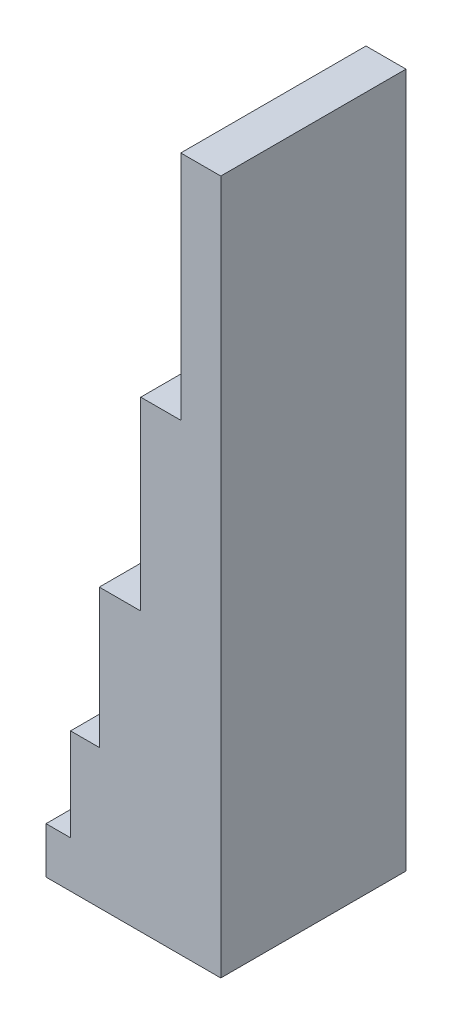
ISO-10303-21;
HEADER;
FILE_DESCRIPTION(('STEP AP214'),'2;1');
FILE_NAME('part.step','',(''),(''),'','','');
FILE_SCHEMA(('AUTOMOTIVE_DESIGN { 1 0 10303 214 1 1 1 1 }'));
ENDSEC;
DATA;
#1=APPLICATION_CONTEXT('core data for automotive mechanical design processes');
#2=APPLICATION_PROTOCOL_DEFINITION('international standard','automotive_design',2000,#1);
#3=PRODUCT_CONTEXT('',#1,'mechanical');
#4=PRODUCT('Part','Part','',(#3));
#5=PRODUCT_RELATED_PRODUCT_CATEGORY('part','',(#4));
#6=PRODUCT_DEFINITION_FORMATION('','',#4);
#7=PRODUCT_DEFINITION_CONTEXT('part definition',#1,'design');
#8=PRODUCT_DEFINITION('design','',#6,#7);
#9=PRODUCT_DEFINITION_SHAPE('','',#8);
#10=(LENGTH_UNIT() NAMED_UNIT(*) SI_UNIT(.MILLI.,.METRE.));
#11=(NAMED_UNIT(*) PLANE_ANGLE_UNIT() SI_UNIT($,.RADIAN.));
#12=(NAMED_UNIT(*) SI_UNIT($,.STERADIAN.) SOLID_ANGLE_UNIT());
#13=UNCERTAINTY_MEASURE_WITH_UNIT(LENGTH_MEASURE(1.E-05),#10,'distance_accuracy_value','');
#14=(GEOMETRIC_REPRESENTATION_CONTEXT(3) GLOBAL_UNCERTAINTY_ASSIGNED_CONTEXT((#13)) GLOBAL_UNIT_ASSIGNED_CONTEXT((#10,
#11,#12)) REPRESENTATION_CONTEXT('',''));
#15=CARTESIAN_POINT('',(0.,0.,0.));
#16=DIRECTION('',(0.,0.,1.));
#17=DIRECTION('',(1.,0.,0.));
#18=AXIS2_PLACEMENT_3D('',#15,#16,#17);
#19=CARTESIAN_POINT('',(9.43573727404154,0.,10.));
#20=DIRECTION('',(0.,1.,0.));
#21=DIRECTION('',(0.,0.,1.));
#22=AXIS2_PLACEMENT_3D('',#19,#20,#21);
#23=PLANE('',#22);
#24=DIRECTION('',(1.,0.,0.));
#25=VECTOR('',#24,1.);
#26=CARTESIAN_POINT('',(9.43573727404154,0.,0.));
#27=LINE('',#26,#25);
#28=CARTESIAN_POINT('',(0.,0.,0.));
#29=VERTEX_POINT('',#28);
#30=CARTESIAN_POINT('',(9.43573727404154,0.,0.));
#31=VERTEX_POINT('',#30);
#32=EDGE_CURVE('E168',#29,#31,#27,.T.);
#33=ORIENTED_EDGE('',*,*,#32,.T.);
#34=DIRECTION('',(0.,0.,-1.));
#35=VECTOR('',#34,1.);
#36=CARTESIAN_POINT('',(9.43573727404154,0.,10.));
#37=LINE('',#36,#35);
#38=CARTESIAN_POINT('',(9.43573727404154,0.,10.));
#39=VERTEX_POINT('',#38);
#40=EDGE_CURVE('E11',#39,#31,#37,.T.);
#41=ORIENTED_EDGE('',*,*,#40,.F.);
#42=DIRECTION('',(1.,0.,0.));
#43=VECTOR('',#42,1.);
#44=CARTESIAN_POINT('',(9.43573727404154,0.,10.));
#45=LINE('',#44,#43);
#46=CARTESIAN_POINT('',(0.,0.,10.));
#47=VERTEX_POINT('',#46);
#48=EDGE_CURVE('E204',#47,#39,#45,.T.);
#49=ORIENTED_EDGE('',*,*,#48,.F.);
#50=DIRECTION('',(0.,0.,-1.));
#51=VECTOR('',#50,1.);
#52=CARTESIAN_POINT('',(0.,0.,10.));
#53=LINE('',#52,#51);
#54=EDGE_CURVE('E167',#47,#29,#53,.T.);
#55=ORIENTED_EDGE('',*,*,#54,.T.);
#56=EDGE_LOOP('',(#33,#41,#49,#55));
#57=FACE_BOUND('',#56,.T.);
#58=ADVANCED_FACE('F44',(#57),#23,.F.);
#59=CARTESIAN_POINT('',(9.43573727404153,37.5,10.));
#60=DIRECTION('',(-1.,0.,0.));
#61=DIRECTION('',(0.,-1.,0.));
#62=AXIS2_PLACEMENT_3D('',#59,#60,#61);
#63=PLANE('',#62);
#64=DIRECTION('',(0.,1.,0.));
#65=VECTOR('',#64,1.);
#66=CARTESIAN_POINT('',(9.43573727404153,37.5,0.));
#67=LINE('',#66,#65);
#68=CARTESIAN_POINT('',(9.43573727404153,37.5,0.));
#69=VERTEX_POINT('',#68);
#70=EDGE_CURVE('E173',#31,#69,#67,.T.);
#71=ORIENTED_EDGE('',*,*,#70,.T.);
#72=DIRECTION('',(0.,0.,-1.));
#73=VECTOR('',#72,1.);
#74=CARTESIAN_POINT('',(9.43573727404153,37.5,10.));
#75=LINE('',#74,#73);
#76=CARTESIAN_POINT('',(9.43573727404153,37.5,10.));
#77=VERTEX_POINT('',#76);
#78=EDGE_CURVE('E53',#77,#69,#75,.T.);
#79=ORIENTED_EDGE('',*,*,#78,.F.);
#80=DIRECTION('',(0.,1.,0.));
#81=VECTOR('',#80,1.);
#82=CARTESIAN_POINT('',(9.43573727404154,25.,10.));
#83=LINE('',#82,#81);
#84=EDGE_CURVE('E116',#39,#77,#83,.T.);
#85=ORIENTED_EDGE('',*,*,#84,.F.);
#86=ORIENTED_EDGE('',*,*,#40,.T.);
#87=EDGE_LOOP('',(#71,#79,#85,#86));
#88=FACE_BOUND('',#87,.T.);
#89=ADVANCED_FACE('F300',(#88),#63,.F.);
#90=CARTESIAN_POINT('',(7.27495243022971,37.5,10.));
#91=DIRECTION('',(0.,-1.,0.));
#92=DIRECTION('',(0.,0.,-1.));
#93=AXIS2_PLACEMENT_3D('',#90,#91,#92);
#94=PLANE('',#93);
#95=DIRECTION('',(-1.,0.,0.));
#96=VECTOR('',#95,1.);
#97=CARTESIAN_POINT('',(7.27495243022971,37.5,0.));
#98=LINE('',#97,#96);
#99=CARTESIAN_POINT('',(7.27495243022971,37.5,0.));
#100=VERTEX_POINT('',#99);
#101=EDGE_CURVE('E180',#69,#100,#98,.T.);
#102=ORIENTED_EDGE('',*,*,#101,.T.);
#103=DIRECTION('',(0.,0.,-1.));
#104=VECTOR('',#103,1.);
#105=CARTESIAN_POINT('',(7.27495243022971,37.5,10.));
#106=LINE('',#105,#104);
#107=CARTESIAN_POINT('',(7.27495243022971,37.5,10.));
#108=VERTEX_POINT('',#107);
#109=EDGE_CURVE('E231',#108,#100,#106,.T.);
#110=ORIENTED_EDGE('',*,*,#109,.F.);
#111=DIRECTION('',(-1.,0.,0.));
#112=VECTOR('',#111,1.);
#113=CARTESIAN_POINT('',(7.27495243022971,37.5,10.));
#114=LINE('',#113,#112);
#115=EDGE_CURVE('E244',#77,#108,#114,.T.);
#116=ORIENTED_EDGE('',*,*,#115,.F.);
#117=ORIENTED_EDGE('',*,*,#78,.T.);
#118=EDGE_LOOP('',(#102,#110,#116,#117));
#119=FACE_BOUND('',#118,.T.);
#120=ADVANCED_FACE('F239',(#119),#94,.F.);
#121=CARTESIAN_POINT('',(7.27495243022971,25.,10.));
#122=DIRECTION('',(1.,0.,0.));
#123=DIRECTION('',(0.,0.,-1.));
#124=AXIS2_PLACEMENT_3D('',#121,#122,#123);
#125=PLANE('',#124);
#126=DIRECTION('',(0.,-1.,0.));
#127=VECTOR('',#126,1.);
#128=CARTESIAN_POINT('',(7.27495243022971,25.,0.));
#129=LINE('',#128,#127);
#130=CARTESIAN_POINT('',(7.27495243022971,25.,0.));
#131=VERTEX_POINT('',#130);
#132=EDGE_CURVE('E179',#100,#131,#129,.T.);
#133=ORIENTED_EDGE('',*,*,#132,.T.);
#134=DIRECTION('',(0.,0.,-1.));
#135=VECTOR('',#134,1.);
#136=CARTESIAN_POINT('',(7.27495243022971,25.,10.));
#137=LINE('',#136,#135);
#138=CARTESIAN_POINT('',(7.27495243022971,25.,10.));
#139=VERTEX_POINT('',#138);
#140=EDGE_CURVE('E226',#139,#131,#137,.T.);
#141=ORIENTED_EDGE('',*,*,#140,.F.);
#142=DIRECTION('',(0.,-1.,0.));
#143=VECTOR('',#142,1.);
#144=CARTESIAN_POINT('',(7.27495243022971,25.,10.));
#145=LINE('',#144,#143);
#146=EDGE_CURVE('E257',#108,#139,#145,.T.);
#147=ORIENTED_EDGE('',*,*,#146,.F.);
#148=ORIENTED_EDGE('',*,*,#109,.T.);
#149=EDGE_LOOP('',(#133,#141,#147,#148));
#150=FACE_BOUND('',#149,.T.);
#151=ADVANCED_FACE('F249',(#150),#125,.F.);
#152=CARTESIAN_POINT('',(5.11416758641788,25.,10.));
#153=DIRECTION('',(0.,-1.,0.));
#154=DIRECTION('',(0.,0.,-1.));
#155=AXIS2_PLACEMENT_3D('',#152,#153,#154);
#156=PLANE('',#155);
#157=DIRECTION('',(-1.,0.,0.));
#158=VECTOR('',#157,1.);
#159=CARTESIAN_POINT('',(5.11416758641788,25.,0.));
#160=LINE('',#159,#158);
#161=CARTESIAN_POINT('',(5.11416758641788,25.,0.));
#162=VERTEX_POINT('',#161);
#163=EDGE_CURVE('E181',#131,#162,#160,.T.);
#164=ORIENTED_EDGE('',*,*,#163,.T.);
#165=DIRECTION('',(0.,0.,-1.));
#166=VECTOR('',#165,1.);
#167=CARTESIAN_POINT('',(5.11416758641788,25.,10.));
#168=LINE('',#167,#166);
#169=CARTESIAN_POINT('',(5.11416758641788,25.,10.));
#170=VERTEX_POINT('',#169);
#171=EDGE_CURVE('E224',#170,#162,#168,.T.);
#172=ORIENTED_EDGE('',*,*,#171,.F.);
#173=DIRECTION('',(-1.,0.,0.));
#174=VECTOR('',#173,1.);
#175=CARTESIAN_POINT('',(5.11416758641788,25.,10.));
#176=LINE('',#175,#174);
#177=EDGE_CURVE('E258',#139,#170,#176,.T.);
#178=ORIENTED_EDGE('',*,*,#177,.F.);
#179=ORIENTED_EDGE('',*,*,#140,.T.);
#180=EDGE_LOOP('',(#164,#172,#178,#179));
#181=FACE_BOUND('',#180,.T.);
#182=ADVANCED_FACE('F255',(#181),#156,.F.);
#183=CARTESIAN_POINT('',(5.11416758641788,15.,10.));
#184=DIRECTION('',(1.,0.,0.));
#185=DIRECTION('',(0.,0.,-1.));
#186=AXIS2_PLACEMENT_3D('',#183,#184,#185);
#187=PLANE('',#186);
#188=DIRECTION('',(0.,-1.,0.));
#189=VECTOR('',#188,1.);
#190=CARTESIAN_POINT('',(5.11416758641788,15.,0.));
#191=LINE('',#190,#189);
#192=CARTESIAN_POINT('',(5.11416758641788,15.,0.));
#193=VERTEX_POINT('',#192);
#194=EDGE_CURVE('E189',#162,#193,#191,.T.);
#195=ORIENTED_EDGE('',*,*,#194,.T.);
#196=DIRECTION('',(0.,0.,-1.));
#197=VECTOR('',#196,1.);
#198=CARTESIAN_POINT('',(5.11416758641788,15.,10.));
#199=LINE('',#198,#197);
#200=CARTESIAN_POINT('',(5.11416758641788,15.,10.));
#201=VERTEX_POINT('',#200);
#202=EDGE_CURVE('E218',#201,#193,#199,.T.);
#203=ORIENTED_EDGE('',*,*,#202,.F.);
#204=DIRECTION('',(0.,-1.,0.));
#205=VECTOR('',#204,1.);
#206=CARTESIAN_POINT('',(5.11416758641788,15.,10.));
#207=LINE('',#206,#205);
#208=EDGE_CURVE('E259',#170,#201,#207,.T.);
#209=ORIENTED_EDGE('',*,*,#208,.F.);
#210=ORIENTED_EDGE('',*,*,#171,.T.);
#211=EDGE_LOOP('',(#195,#203,#209,#210));
#212=FACE_BOUND('',#211,.T.);
#213=ADVANCED_FACE('F313',(#212),#187,.F.);
#214=CARTESIAN_POINT('',(2.87707122749387,15.,10.));
#215=DIRECTION('',(0.,-1.,0.));
#216=DIRECTION('',(0.,0.,-1.));
#217=AXIS2_PLACEMENT_3D('',#214,#215,#216);
#218=PLANE('',#217);
#219=DIRECTION('',(-1.,0.,0.));
#220=VECTOR('',#219,1.);
#221=CARTESIAN_POINT('',(2.87707122749387,15.,0.));
#222=LINE('',#221,#220);
#223=CARTESIAN_POINT('',(2.87707122749387,15.,0.));
#224=VERTEX_POINT('',#223);
#225=EDGE_CURVE('E188',#193,#224,#222,.T.);
#226=ORIENTED_EDGE('',*,*,#225,.T.);
#227=DIRECTION('',(0.,0.,-1.));
#228=VECTOR('',#227,1.);
#229=CARTESIAN_POINT('',(2.87707122749387,15.,10.));
#230=LINE('',#229,#228);
#231=CARTESIAN_POINT('',(2.87707122749387,15.,10.));
#232=VERTEX_POINT('',#231);
#233=EDGE_CURVE('E214',#232,#224,#230,.T.);
#234=ORIENTED_EDGE('',*,*,#233,.F.);
#235=DIRECTION('',(-1.,0.,0.));
#236=VECTOR('',#235,1.);
#237=CARTESIAN_POINT('',(2.87707122749387,15.,10.));
#238=LINE('',#237,#236);
#239=EDGE_CURVE('E262',#201,#232,#238,.T.);
#240=ORIENTED_EDGE('',*,*,#239,.F.);
#241=ORIENTED_EDGE('',*,*,#202,.T.);
#242=EDGE_LOOP('',(#226,#234,#240,#241));
#243=FACE_BOUND('',#242,.T.);
#244=ADVANCED_FACE('F314',(#243),#218,.F.);
#245=CARTESIAN_POINT('',(2.87707122749387,7.5,10.));
#246=DIRECTION('',(1.,0.,0.));
#247=DIRECTION('',(0.,0.,-1.));
#248=AXIS2_PLACEMENT_3D('',#245,#246,#247);
#249=PLANE('',#248);
#250=DIRECTION('',(0.,-1.,0.));
#251=VECTOR('',#250,1.);
#252=CARTESIAN_POINT('',(2.87707122749387,7.5,0.));
#253=LINE('',#252,#251);
#254=CARTESIAN_POINT('',(2.87707122749387,7.5,0.));
#255=VERTEX_POINT('',#254);
#256=EDGE_CURVE('E195',#224,#255,#253,.T.);
#257=ORIENTED_EDGE('',*,*,#256,.T.);
#258=DIRECTION('',(0.,0.,-1.));
#259=VECTOR('',#258,1.);
#260=CARTESIAN_POINT('',(2.87707122749387,7.5,10.));
#261=LINE('',#260,#259);
#262=CARTESIAN_POINT('',(2.87707122749387,7.5,10.));
#263=VERTEX_POINT('',#262);
#264=EDGE_CURVE('E211',#263,#255,#261,.T.);
#265=ORIENTED_EDGE('',*,*,#264,.F.);
#266=DIRECTION('',(0.,-1.,0.));
#267=VECTOR('',#266,1.);
#268=CARTESIAN_POINT('',(2.87707122749387,7.5,10.));
#269=LINE('',#268,#267);
#270=EDGE_CURVE('E271',#232,#263,#269,.T.);
#271=ORIENTED_EDGE('',*,*,#270,.F.);
#272=ORIENTED_EDGE('',*,*,#233,.T.);
#273=EDGE_LOOP('',(#257,#265,#271,#272));
#274=FACE_BOUND('',#273,.T.);
#275=ADVANCED_FACE('F276',(#274),#249,.F.);
#276=CARTESIAN_POINT('',(1.32353208935219,7.5,10.));
#277=DIRECTION('',(0.,-1.,0.));
#278=DIRECTION('',(0.,0.,-1.));
#279=AXIS2_PLACEMENT_3D('',#276,#277,#278);
#280=PLANE('',#279);
#281=DIRECTION('',(-1.,0.,0.));
#282=VECTOR('',#281,1.);
#283=CARTESIAN_POINT('',(1.32353208935219,7.5,0.));
#284=LINE('',#283,#282);
#285=CARTESIAN_POINT('',(1.32353208935219,7.5,0.));
#286=VERTEX_POINT('',#285);
#287=EDGE_CURVE('E194',#255,#286,#284,.T.);
#288=ORIENTED_EDGE('',*,*,#287,.T.);
#289=DIRECTION('',(0.,0.,-1.));
#290=VECTOR('',#289,1.);
#291=CARTESIAN_POINT('',(1.32353208935219,7.5,10.));
#292=LINE('',#291,#290);
#293=CARTESIAN_POINT('',(1.32353208935219,7.5,10.));
#294=VERTEX_POINT('',#293);
#295=EDGE_CURVE('E157',#294,#286,#292,.T.);
#296=ORIENTED_EDGE('',*,*,#295,.F.);
#297=DIRECTION('',(-1.,0.,0.));
#298=VECTOR('',#297,1.);
#299=CARTESIAN_POINT('',(1.32353208935219,7.5,10.));
#300=LINE('',#299,#298);
#301=EDGE_CURVE('E146',#263,#294,#300,.T.);
#302=ORIENTED_EDGE('',*,*,#301,.F.);
#303=ORIENTED_EDGE('',*,*,#264,.T.);
#304=EDGE_LOOP('',(#288,#296,#302,#303));
#305=FACE_BOUND('',#304,.T.);
#306=ADVANCED_FACE('F285',(#305),#280,.F.);
#307=CARTESIAN_POINT('',(1.32353208935219,2.5,10.));
#308=DIRECTION('',(1.,0.,0.));
#309=DIRECTION('',(0.,0.,-1.));
#310=AXIS2_PLACEMENT_3D('',#307,#308,#309);
#311=PLANE('',#310);
#312=DIRECTION('',(0.,-1.,0.));
#313=VECTOR('',#312,1.);
#314=CARTESIAN_POINT('',(1.32353208935219,2.5,0.));
#315=LINE('',#314,#313);
#316=CARTESIAN_POINT('',(1.32353208935219,2.5,0.));
#317=VERTEX_POINT('',#316);
#318=EDGE_CURVE('E160',#286,#317,#315,.T.);
#319=ORIENTED_EDGE('',*,*,#318,.T.);
#320=DIRECTION('',(0.,0.,-1.));
#321=VECTOR('',#320,1.);
#322=CARTESIAN_POINT('',(1.32353208935219,2.5,10.));
#323=LINE('',#322,#321);
#324=CARTESIAN_POINT('',(1.32353208935219,2.5,10.));
#325=VERTEX_POINT('',#324);
#326=EDGE_CURVE('E152',#325,#317,#323,.T.);
#327=ORIENTED_EDGE('',*,*,#326,.F.);
#328=DIRECTION('',(0.,-1.,0.));
#329=VECTOR('',#328,1.);
#330=CARTESIAN_POINT('',(1.32353208935219,2.5,10.));
#331=LINE('',#330,#329);
#332=EDGE_CURVE('E142',#294,#325,#331,.T.);
#333=ORIENTED_EDGE('',*,*,#332,.F.);
#334=ORIENTED_EDGE('',*,*,#295,.T.);
#335=EDGE_LOOP('',(#319,#327,#333,#334));
#336=FACE_BOUND('',#335,.T.);
#337=ADVANCED_FACE('F154',(#336),#311,.F.);
#338=CARTESIAN_POINT('',(0.,2.5,10.));
#339=DIRECTION('',(0.,-1.,0.));
#340=DIRECTION('',(0.,0.,-1.));
#341=AXIS2_PLACEMENT_3D('',#338,#339,#340);
#342=PLANE('',#341);
#343=DIRECTION('',(-1.,0.,0.));
#344=VECTOR('',#343,1.);
#345=CARTESIAN_POINT('',(0.,2.5,0.));
#346=LINE('',#345,#344);
#347=CARTESIAN_POINT('',(0.,2.5,0.));
#348=VERTEX_POINT('',#347);
#349=EDGE_CURVE('E103',#317,#348,#346,.T.);
#350=ORIENTED_EDGE('',*,*,#349,.T.);
#351=DIRECTION('',(0.,0.,-1.));
#352=VECTOR('',#351,1.);
#353=CARTESIAN_POINT('',(0.,2.5,10.));
#354=LINE('',#353,#352);
#355=CARTESIAN_POINT('',(0.,2.5,10.));
#356=VERTEX_POINT('',#355);
#357=EDGE_CURVE('E159',#356,#348,#354,.T.);
#358=ORIENTED_EDGE('',*,*,#357,.F.);
#359=DIRECTION('',(-1.,0.,0.));
#360=VECTOR('',#359,1.);
#361=CARTESIAN_POINT('',(0.,2.5,10.));
#362=LINE('',#361,#360);
#363=EDGE_CURVE('E148',#325,#356,#362,.T.);
#364=ORIENTED_EDGE('',*,*,#363,.F.);
#365=ORIENTED_EDGE('',*,*,#326,.T.);
#366=EDGE_LOOP('',(#350,#358,#364,#365));
#367=FACE_BOUND('',#366,.T.);
#368=ADVANCED_FACE('F165',(#367),#342,.F.);
#369=CARTESIAN_POINT('',(0.,0.,10.));
#370=DIRECTION('',(1.,0.,0.));
#371=DIRECTION('',(0.,0.,-1.));
#372=AXIS2_PLACEMENT_3D('',#369,#370,#371);
#373=PLANE('',#372);
#374=DIRECTION('',(0.,-1.,0.));
#375=VECTOR('',#374,1.);
#376=CARTESIAN_POINT('',(0.,0.,0.));
#377=LINE('',#376,#375);
#378=EDGE_CURVE('E108',#348,#29,#377,.T.);
#379=ORIENTED_EDGE('',*,*,#378,.T.);
#380=ORIENTED_EDGE('',*,*,#54,.F.);
#381=DIRECTION('',(0.,-1.,0.));
#382=VECTOR('',#381,1.);
#383=CARTESIAN_POINT('',(0.,0.,10.));
#384=LINE('',#383,#382);
#385=EDGE_CURVE('E61',#356,#47,#384,.T.);
#386=ORIENTED_EDGE('',*,*,#385,.F.);
#387=ORIENTED_EDGE('',*,*,#357,.T.);
#388=EDGE_LOOP('',(#379,#380,#386,#387));
#389=FACE_BOUND('',#388,.T.);
#390=ADVANCED_FACE('F290',(#389),#373,.F.);
#391=CARTESIAN_POINT('',(0.,0.,10.));
#392=DIRECTION('',(0.,0.,-1.));
#393=DIRECTION('',(-1.,0.,0.));
#394=AXIS2_PLACEMENT_3D('',#391,#392,#393);
#395=PLANE('',#394);
#396=ORIENTED_EDGE('',*,*,#48,.T.);
#397=ORIENTED_EDGE('',*,*,#84,.T.);
#398=ORIENTED_EDGE('',*,*,#115,.T.);
#399=ORIENTED_EDGE('',*,*,#146,.T.);
#400=ORIENTED_EDGE('',*,*,#177,.T.);
#401=ORIENTED_EDGE('',*,*,#208,.T.);
#402=ORIENTED_EDGE('',*,*,#239,.T.);
#403=ORIENTED_EDGE('',*,*,#270,.T.);
#404=ORIENTED_EDGE('',*,*,#301,.T.);
#405=ORIENTED_EDGE('',*,*,#332,.T.);
#406=ORIENTED_EDGE('',*,*,#363,.T.);
#407=ORIENTED_EDGE('',*,*,#385,.T.);
#408=EDGE_LOOP('',(#396,#397,#398,#399,#400,#401,#402,#403,#404,#405,#406,#407));
#409=FACE_BOUND('',#408,.T.);
#410=ADVANCED_FACE('F145',(#409),#395,.F.);
#411=CARTESIAN_POINT('',(0.,0.,0.));
#412=DIRECTION('',(0.,0.,-1.));
#413=DIRECTION('',(-1.,0.,0.));
#414=AXIS2_PLACEMENT_3D('',#411,#412,#413);
#415=PLANE('',#414);
#416=ORIENTED_EDGE('',*,*,#32,.F.);
#417=ORIENTED_EDGE('',*,*,#378,.F.);
#418=ORIENTED_EDGE('',*,*,#349,.F.);
#419=ORIENTED_EDGE('',*,*,#318,.F.);
#420=ORIENTED_EDGE('',*,*,#287,.F.);
#421=ORIENTED_EDGE('',*,*,#256,.F.);
#422=ORIENTED_EDGE('',*,*,#225,.F.);
#423=ORIENTED_EDGE('',*,*,#194,.F.);
#424=ORIENTED_EDGE('',*,*,#163,.F.);
#425=ORIENTED_EDGE('',*,*,#132,.F.);
#426=ORIENTED_EDGE('',*,*,#101,.F.);
#427=ORIENTED_EDGE('',*,*,#70,.F.);
#428=EDGE_LOOP('',(#416,#417,#418,#419,#420,#421,#422,#423,#424,#425,#426,#427));
#429=FACE_BOUND('',#428,.T.);
#430=ADVANCED_FACE('F242',(#429),#415,.T.);
#431=CLOSED_SHELL('',(#58,#89,#120,#151,#182,#213,#244,#275,#306,#337,#368,#390,#410,#430));
#432=MANIFOLD_SOLID_BREP('B2',#431);
#433=ADVANCED_BREP_SHAPE_REPRESENTATION('',(#18,#432),#14);
#434=SHAPE_DEFINITION_REPRESENTATION(#9,#433);
ENDSEC;
END-ISO-10303-21;
